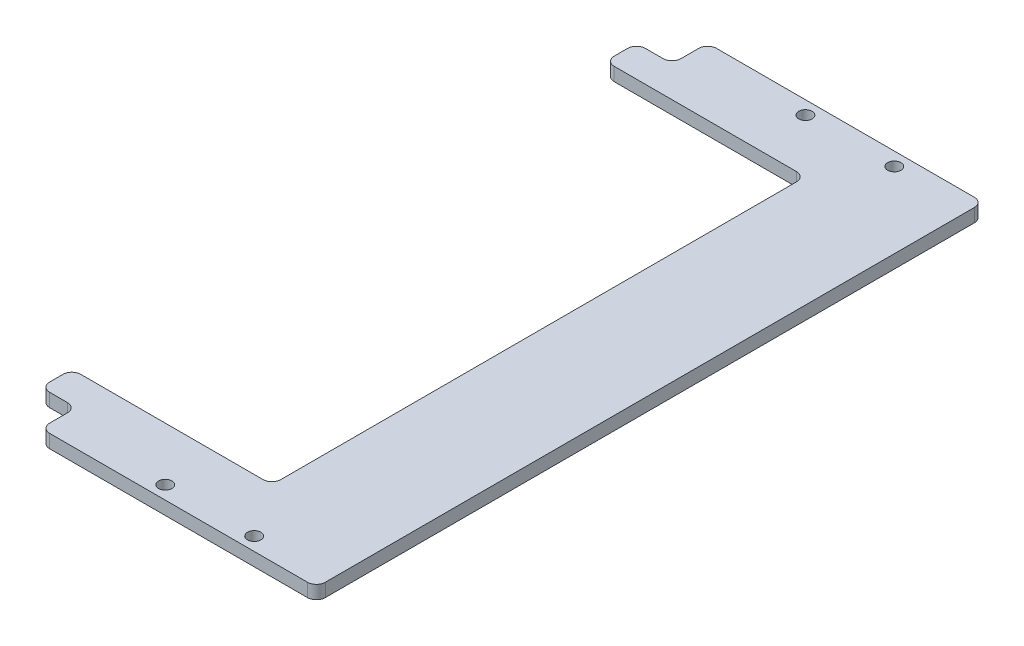
ISO-10303-21;
HEADER;
FILE_DESCRIPTION(('STEP AP214'),'2;1');
FILE_NAME('part.step','',(''),(''),'','','');
FILE_SCHEMA(('AUTOMOTIVE_DESIGN { 1 0 10303 214 1 1 1 1 }'));
ENDSEC;
DATA;
#1=APPLICATION_CONTEXT('core data for automotive mechanical design processes');
#2=APPLICATION_PROTOCOL_DEFINITION('international standard','automotive_design',2000,#1);
#3=PRODUCT_CONTEXT('',#1,'mechanical');
#4=PRODUCT('Part','Part','',(#3));
#5=PRODUCT_RELATED_PRODUCT_CATEGORY('part','',(#4));
#6=PRODUCT_DEFINITION_FORMATION('','',#4);
#7=PRODUCT_DEFINITION_CONTEXT('part definition',#1,'design');
#8=PRODUCT_DEFINITION('design','',#6,#7);
#9=PRODUCT_DEFINITION_SHAPE('','',#8);
#10=(LENGTH_UNIT() NAMED_UNIT(*) SI_UNIT(.MILLI.,.METRE.));
#11=(NAMED_UNIT(*) PLANE_ANGLE_UNIT() SI_UNIT($,.RADIAN.));
#12=(NAMED_UNIT(*) SI_UNIT($,.STERADIAN.) SOLID_ANGLE_UNIT());
#13=UNCERTAINTY_MEASURE_WITH_UNIT(LENGTH_MEASURE(1.E-05),#10,'distance_accuracy_value','');
#14=(GEOMETRIC_REPRESENTATION_CONTEXT(3) GLOBAL_UNCERTAINTY_ASSIGNED_CONTEXT((#13)) GLOBAL_UNIT_ASSIGNED_CONTEXT((#10,
#11,#12)) REPRESENTATION_CONTEXT('',''));
#15=CARTESIAN_POINT('',(0.,0.,0.));
#16=DIRECTION('',(0.,0.,1.));
#17=DIRECTION('',(1.,0.,0.));
#18=AXIS2_PLACEMENT_3D('',#15,#16,#17);
#19=CARTESIAN_POINT('',(0.,3.,0.));
#20=DIRECTION('',(0.,0.,-1.));
#21=DIRECTION('',(-1.,0.,0.));
#22=AXIS2_PLACEMENT_3D('',#19,#20,#21);
#23=PLANE('',#22);
#24=DIRECTION('',(1.,0.,0.));
#25=VECTOR('',#24,1.);
#26=CARTESIAN_POINT('',(0.,0.,0.));
#27=LINE('',#26,#25);
#28=CARTESIAN_POINT('',(10.,0.,0.));
#29=VERTEX_POINT('',#28);
#30=CARTESIAN_POINT('',(68.,0.,0.));
#31=VERTEX_POINT('',#30);
#32=EDGE_CURVE('E229',#29,#31,#27,.T.);
#33=ORIENTED_EDGE('',*,*,#32,.T.);
#34=DIRECTION('',(0.,-1.,0.));
#35=VECTOR('',#34,1.);
#36=CARTESIAN_POINT('',(68.,3.,0.));
#37=LINE('',#36,#35);
#38=CARTESIAN_POINT('',(68.,3.,0.));
#39=VERTEX_POINT('',#38);
#40=EDGE_CURVE('E210',#31,#39,#37,.F.);
#41=ORIENTED_EDGE('',*,*,#40,.T.);
#42=DIRECTION('',(1.,0.,0.));
#43=VECTOR('',#42,1.);
#44=CARTESIAN_POINT('',(0.,3.,0.));
#45=LINE('',#44,#43);
#46=CARTESIAN_POINT('',(10.,3.,0.));
#47=VERTEX_POINT('',#46);
#48=EDGE_CURVE('E412',#47,#39,#45,.T.);
#49=ORIENTED_EDGE('',*,*,#48,.F.);
#50=DIRECTION('',(0.,1.,0.));
#51=VECTOR('',#50,1.);
#52=CARTESIAN_POINT('',(10.,3.,0.));
#53=LINE('',#52,#51);
#54=EDGE_CURVE('E215',#47,#29,#53,.F.);
#55=ORIENTED_EDGE('',*,*,#54,.T.);
#56=EDGE_LOOP('',(#33,#41,#49,#55));
#57=FACE_BOUND('',#56,.T.);
#58=ADVANCED_FACE('F41',(#57),#23,.F.);
#59=CARTESIAN_POINT('',(0.,3.,-150.));
#60=DIRECTION('',(1.,0.,0.));
#61=DIRECTION('',(0.,0.,-1.));
#62=AXIS2_PLACEMENT_3D('',#59,#60,#61);
#63=PLANE('',#62);
#64=DIRECTION('',(0.,0.,1.));
#65=VECTOR('',#64,1.);
#66=CARTESIAN_POINT('',(0.,3.,-150.));
#67=LINE('',#66,#65);
#68=CARTESIAN_POINT('',(0.,3.,-140.));
#69=VERTEX_POINT('',#68);
#70=CARTESIAN_POINT('',(0.,3.,-137.));
#71=VERTEX_POINT('',#70);
#72=EDGE_CURVE('E407',#69,#71,#67,.T.);
#73=ORIENTED_EDGE('',*,*,#72,.F.);
#74=DIRECTION('',(0.,1.,0.));
#75=VECTOR('',#74,1.);
#76=CARTESIAN_POINT('',(0.,3.,-140.));
#77=LINE('',#76,#75);
#78=CARTESIAN_POINT('',(0.,0.,-140.));
#79=VERTEX_POINT('',#78);
#80=EDGE_CURVE('E324',#69,#79,#77,.F.);
#81=ORIENTED_EDGE('',*,*,#80,.T.);
#82=DIRECTION('',(0.,0.,1.));
#83=VECTOR('',#82,1.);
#84=CARTESIAN_POINT('',(0.,0.,-150.));
#85=LINE('',#84,#83);
#86=CARTESIAN_POINT('',(0.,0.,-137.));
#87=VERTEX_POINT('',#86);
#88=EDGE_CURVE('E235',#79,#87,#85,.T.);
#89=ORIENTED_EDGE('',*,*,#88,.T.);
#90=DIRECTION('',(0.,-1.,0.));
#91=VECTOR('',#90,1.);
#92=CARTESIAN_POINT('',(0.,3.,-137.));
#93=LINE('',#92,#91);
#94=EDGE_CURVE('E323',#87,#71,#93,.F.);
#95=ORIENTED_EDGE('',*,*,#94,.T.);
#96=EDGE_LOOP('',(#73,#81,#89,#95));
#97=FACE_BOUND('',#96,.T.);
#98=ADVANCED_FACE('F462',(#97),#63,.F.);
#99=CARTESIAN_POINT('',(0.,3.,-15.));
#100=DIRECTION('',(1.,0.,0.));
#101=DIRECTION('',(0.,0.,-1.));
#102=AXIS2_PLACEMENT_3D('',#99,#100,#101);
#103=PLANE('',#102);
#104=DIRECTION('',(0.,0.,1.));
#105=VECTOR('',#104,1.);
#106=CARTESIAN_POINT('',(0.,3.,-15.));
#107=LINE('',#106,#105);
#108=CARTESIAN_POINT('',(0.,3.,-13.));
#109=VERTEX_POINT('',#108);
#110=CARTESIAN_POINT('',(0.,3.,-10.));
#111=VERTEX_POINT('',#110);
#112=EDGE_CURVE('E248',#109,#111,#107,.T.);
#113=ORIENTED_EDGE('',*,*,#112,.F.);
#114=DIRECTION('',(0.,-1.,0.));
#115=VECTOR('',#114,1.);
#116=CARTESIAN_POINT('',(0.,3.,-13.));
#117=LINE('',#116,#115);
#118=CARTESIAN_POINT('',(0.,0.,-13.));
#119=VERTEX_POINT('',#118);
#120=EDGE_CURVE('E344',#109,#119,#117,.T.);
#121=ORIENTED_EDGE('',*,*,#120,.T.);
#122=DIRECTION('',(0.,0.,1.));
#123=VECTOR('',#122,1.);
#124=CARTESIAN_POINT('',(0.,0.,-15.));
#125=LINE('',#124,#123);
#126=CARTESIAN_POINT('',(0.,0.,-10.));
#127=VERTEX_POINT('',#126);
#128=EDGE_CURVE('E233',#119,#127,#125,.T.);
#129=ORIENTED_EDGE('',*,*,#128,.T.);
#130=DIRECTION('',(0.,1.,0.));
#131=VECTOR('',#130,1.);
#132=CARTESIAN_POINT('',(0.,3.,-10.));
#133=LINE('',#132,#131);
#134=EDGE_CURVE('E345',#127,#111,#133,.T.);
#135=ORIENTED_EDGE('',*,*,#134,.T.);
#136=EDGE_LOOP('',(#113,#121,#129,#135));
#137=FACE_BOUND('',#136,.T.);
#138=ADVANCED_FACE('F394',(#137),#103,.F.);
#139=CARTESIAN_POINT('',(70.,3.,0.));
#140=DIRECTION('',(-1.,0.,0.));
#141=DIRECTION('',(0.,0.,1.));
#142=AXIS2_PLACEMENT_3D('',#139,#140,#141);
#143=PLANE('',#142);
#144=DIRECTION('',(0.,0.,-1.));
#145=VECTOR('',#144,1.);
#146=CARTESIAN_POINT('',(70.,3.,0.));
#147=LINE('',#146,#145);
#148=CARTESIAN_POINT('',(70.,3.,-2.));
#149=VERTEX_POINT('',#148);
#150=CARTESIAN_POINT('',(70.,3.,-148.));
#151=VERTEX_POINT('',#150);
#152=EDGE_CURVE('E225',#149,#151,#147,.T.);
#153=ORIENTED_EDGE('',*,*,#152,.F.);
#154=DIRECTION('',(0.,-1.,0.));
#155=VECTOR('',#154,1.);
#156=CARTESIAN_POINT('',(70.,3.,-2.));
#157=LINE('',#156,#155);
#158=CARTESIAN_POINT('',(70.,0.,-2.));
#159=VERTEX_POINT('',#158);
#160=EDGE_CURVE('E206',#149,#159,#157,.T.);
#161=ORIENTED_EDGE('',*,*,#160,.T.);
#162=DIRECTION('',(0.,0.,-1.));
#163=VECTOR('',#162,1.);
#164=CARTESIAN_POINT('',(70.,0.,0.));
#165=LINE('',#164,#163);
#166=CARTESIAN_POINT('',(70.,0.,-148.));
#167=VERTEX_POINT('',#166);
#168=EDGE_CURVE('E218',#159,#167,#165,.T.);
#169=ORIENTED_EDGE('',*,*,#168,.T.);
#170=DIRECTION('',(0.,-1.,0.));
#171=VECTOR('',#170,1.);
#172=CARTESIAN_POINT('',(70.,3.,-148.));
#173=LINE('',#172,#171);
#174=EDGE_CURVE('E221',#167,#151,#173,.F.);
#175=ORIENTED_EDGE('',*,*,#174,.T.);
#176=EDGE_LOOP('',(#153,#161,#169,#175));
#177=FACE_BOUND('',#176,.T.);
#178=ADVANCED_FACE('F217',(#177),#143,.F.);
#179=CARTESIAN_POINT('',(70.,3.,-150.));
#180=DIRECTION('',(0.,0.,1.));
#181=DIRECTION('',(1.,0.,0.));
#182=AXIS2_PLACEMENT_3D('',#179,#180,#181);
#183=PLANE('',#182);
#184=DIRECTION('',(-1.,0.,0.));
#185=VECTOR('',#184,1.);
#186=CARTESIAN_POINT('',(70.,3.,-150.));
#187=LINE('',#186,#185);
#188=CARTESIAN_POINT('',(68.,3.,-150.));
#189=VERTEX_POINT('',#188);
#190=CARTESIAN_POINT('',(9.99999999999998,3.,-150.));
#191=VERTEX_POINT('',#190);
#192=EDGE_CURVE('E409',#189,#191,#187,.T.);
#193=ORIENTED_EDGE('',*,*,#192,.F.);
#194=DIRECTION('',(0.,-1.,0.));
#195=VECTOR('',#194,1.);
#196=CARTESIAN_POINT('',(68.,3.,-150.));
#197=LINE('',#196,#195);
#198=CARTESIAN_POINT('',(68.,0.,-150.));
#199=VERTEX_POINT('',#198);
#200=EDGE_CURVE('E309',#189,#199,#197,.T.);
#201=ORIENTED_EDGE('',*,*,#200,.T.);
#202=DIRECTION('',(-1.,0.,0.));
#203=VECTOR('',#202,1.);
#204=CARTESIAN_POINT('',(70.,0.,-150.));
#205=LINE('',#204,#203);
#206=CARTESIAN_POINT('',(9.99999999999998,0.,-150.));
#207=VERTEX_POINT('',#206);
#208=EDGE_CURVE('E228',#199,#207,#205,.T.);
#209=ORIENTED_EDGE('',*,*,#208,.T.);
#210=DIRECTION('',(0.,1.,0.));
#211=VECTOR('',#210,1.);
#212=CARTESIAN_POINT('',(9.99999999999998,3.,-150.));
#213=LINE('',#212,#211);
#214=EDGE_CURVE('E307',#207,#191,#213,.T.);
#215=ORIENTED_EDGE('',*,*,#214,.T.);
#216=EDGE_LOOP('',(#193,#201,#209,#215));
#217=FACE_BOUND('',#216,.T.);
#218=ADVANCED_FACE('F524',(#217),#183,.F.);
#219=CARTESIAN_POINT('',(0.,3.,-135.));
#220=DIRECTION('',(0.,0.,-1.));
#221=DIRECTION('',(-1.,0.,0.));
#222=AXIS2_PLACEMENT_3D('',#219,#220,#221);
#223=PLANE('',#222);
#224=DIRECTION('',(1.,0.,0.));
#225=VECTOR('',#224,1.);
#226=CARTESIAN_POINT('',(0.,3.,-135.));
#227=LINE('',#226,#225);
#228=CARTESIAN_POINT('',(2.,3.,-135.));
#229=VERTEX_POINT('',#228);
#230=CARTESIAN_POINT('',(43.,3.,-135.));
#231=VERTEX_POINT('',#230);
#232=EDGE_CURVE('E401',#229,#231,#227,.T.);
#233=ORIENTED_EDGE('',*,*,#232,.F.);
#234=DIRECTION('',(0.,-1.,0.));
#235=VECTOR('',#234,1.);
#236=CARTESIAN_POINT('',(2.,3.,-135.));
#237=LINE('',#236,#235);
#238=CARTESIAN_POINT('',(2.,0.,-135.));
#239=VERTEX_POINT('',#238);
#240=EDGE_CURVE('E328',#229,#239,#237,.T.);
#241=ORIENTED_EDGE('',*,*,#240,.T.);
#242=DIRECTION('',(1.,0.,0.));
#243=VECTOR('',#242,1.);
#244=CARTESIAN_POINT('',(0.,0.,-135.));
#245=LINE('',#244,#243);
#246=CARTESIAN_POINT('',(43.,0.,-135.));
#247=VERTEX_POINT('',#246);
#248=EDGE_CURVE('E238',#239,#247,#245,.T.);
#249=ORIENTED_EDGE('',*,*,#248,.T.);
#250=DIRECTION('',(0.,-1.,0.));
#251=VECTOR('',#250,1.);
#252=CARTESIAN_POINT('',(43.,3.,-135.));
#253=LINE('',#252,#251);
#254=EDGE_CURVE('E330',#247,#231,#253,.F.);
#255=ORIENTED_EDGE('',*,*,#254,.T.);
#256=EDGE_LOOP('',(#233,#241,#249,#255));
#257=FACE_BOUND('',#256,.T.);
#258=ADVANCED_FACE('F547',(#257),#223,.F.);
#259=CARTESIAN_POINT('',(45.,3.,-135.));
#260=DIRECTION('',(1.,0.,0.));
#261=DIRECTION('',(0.,0.,-1.));
#262=AXIS2_PLACEMENT_3D('',#259,#260,#261);
#263=PLANE('',#262);
#264=DIRECTION('',(0.,0.,1.));
#265=VECTOR('',#264,1.);
#266=CARTESIAN_POINT('',(45.,3.,-135.));
#267=LINE('',#266,#265);
#268=CARTESIAN_POINT('',(45.,3.,-133.));
#269=VERTEX_POINT('',#268);
#270=CARTESIAN_POINT('',(45.,3.,-17.0000000000001));
#271=VERTEX_POINT('',#270);
#272=EDGE_CURVE('E399',#269,#271,#267,.T.);
#273=ORIENTED_EDGE('',*,*,#272,.F.);
#274=DIRECTION('',(0.,-1.,0.));
#275=VECTOR('',#274,1.);
#276=CARTESIAN_POINT('',(45.,0.,-133.));
#277=LINE('',#276,#275);
#278=CARTESIAN_POINT('',(45.,0.,-133.));
#279=VERTEX_POINT('',#278);
#280=EDGE_CURVE('E331',#269,#279,#277,.T.);
#281=ORIENTED_EDGE('',*,*,#280,.T.);
#282=DIRECTION('',(0.,0.,1.));
#283=VECTOR('',#282,1.);
#284=CARTESIAN_POINT('',(45.,0.,-135.));
#285=LINE('',#284,#283);
#286=CARTESIAN_POINT('',(45.,0.,-17.0000000000001));
#287=VERTEX_POINT('',#286);
#288=EDGE_CURVE('E243',#279,#287,#285,.T.);
#289=ORIENTED_EDGE('',*,*,#288,.T.);
#290=DIRECTION('',(0.,-1.,0.));
#291=VECTOR('',#290,1.);
#292=CARTESIAN_POINT('',(45.,3.,-17.));
#293=LINE('',#292,#291);
#294=EDGE_CURVE('E335',#287,#271,#293,.F.);
#295=ORIENTED_EDGE('',*,*,#294,.T.);
#296=EDGE_LOOP('',(#273,#281,#289,#295));
#297=FACE_BOUND('',#296,.T.);
#298=ADVANCED_FACE('F553',(#297),#263,.F.);
#299=CARTESIAN_POINT('',(45.,3.,-15.));
#300=DIRECTION('',(0.,0.,1.));
#301=DIRECTION('',(1.,0.,0.));
#302=AXIS2_PLACEMENT_3D('',#299,#300,#301);
#303=PLANE('',#302);
#304=DIRECTION('',(-1.,0.,0.));
#305=VECTOR('',#304,1.);
#306=CARTESIAN_POINT('',(45.,3.,-15.));
#307=LINE('',#306,#305);
#308=CARTESIAN_POINT('',(43.,3.,-15.));
#309=VERTEX_POINT('',#308);
#310=CARTESIAN_POINT('',(2.00000000000002,3.,-15.));
#311=VERTEX_POINT('',#310);
#312=EDGE_CURVE('E255',#309,#311,#307,.T.);
#313=ORIENTED_EDGE('',*,*,#312,.F.);
#314=DIRECTION('',(0.,-1.,0.));
#315=VECTOR('',#314,1.);
#316=CARTESIAN_POINT('',(43.,0.,-15.));
#317=LINE('',#316,#315);
#318=CARTESIAN_POINT('',(43.,0.,-15.));
#319=VERTEX_POINT('',#318);
#320=EDGE_CURVE('E339',#309,#319,#317,.T.);
#321=ORIENTED_EDGE('',*,*,#320,.T.);
#322=DIRECTION('',(-1.,0.,0.));
#323=VECTOR('',#322,1.);
#324=CARTESIAN_POINT('',(45.,0.,-15.));
#325=LINE('',#324,#323);
#326=CARTESIAN_POINT('',(2.00000000000002,0.,-15.));
#327=VERTEX_POINT('',#326);
#328=EDGE_CURVE('E246',#319,#327,#325,.T.);
#329=ORIENTED_EDGE('',*,*,#328,.T.);
#330=DIRECTION('',(0.,-1.,0.));
#331=VECTOR('',#330,1.);
#332=CARTESIAN_POINT('',(2.,3.,-15.));
#333=LINE('',#332,#331);
#334=EDGE_CURVE('E340',#327,#311,#333,.F.);
#335=ORIENTED_EDGE('',*,*,#334,.T.);
#336=EDGE_LOOP('',(#313,#321,#329,#335));
#337=FACE_BOUND('',#336,.T.);
#338=ADVANCED_FACE('F440',(#337),#303,.F.);
#339=CARTESIAN_POINT('',(0.,3.,0.));
#340=DIRECTION('',(0.,1.,0.));
#341=DIRECTION('',(0.,0.,1.));
#342=AXIS2_PLACEMENT_3D('',#339,#340,#341);
#343=PLANE('',#342);
#344=CARTESIAN_POINT('',(33.0000000000002,3.,-147.));
#345=DIRECTION('',(0.,1.,0.));
#346=DIRECTION('',(0.,0.,-1.));
#347=AXIS2_PLACEMENT_3D('',#344,#345,#346);
#348=CIRCLE('',#347,1.5);
#349=CARTESIAN_POINT('',(33.0000000000002,3.,-148.5));
#350=VERTEX_POINT('',#349);
#351=EDGE_CURVE('E421',#350,#350,#348,.T.);
#352=ORIENTED_EDGE('',*,*,#351,.F.);
#353=EDGE_LOOP('',(#352));
#354=FACE_BOUND('',#353,.T.);
#355=CARTESIAN_POINT('',(53.0000000000002,3.,-147.));
#356=DIRECTION('',(0.,1.,0.));
#357=DIRECTION('',(0.,0.,-1.));
#358=AXIS2_PLACEMENT_3D('',#355,#356,#357);
#359=CIRCLE('',#358,1.5);
#360=CARTESIAN_POINT('',(53.0000000000002,3.,-148.5));
#361=VERTEX_POINT('',#360);
#362=EDGE_CURVE('E426',#361,#361,#359,.T.);
#363=ORIENTED_EDGE('',*,*,#362,.F.);
#364=EDGE_LOOP('',(#363));
#365=FACE_BOUND('',#364,.T.);
#366=CARTESIAN_POINT('',(53.,3.,-3.));
#367=DIRECTION('',(0.,1.,0.));
#368=DIRECTION('',(0.,0.,1.));
#369=AXIS2_PLACEMENT_3D('',#366,#367,#368);
#370=CIRCLE('',#369,1.5);
#371=CARTESIAN_POINT('',(53.,3.,-1.5));
#372=VERTEX_POINT('',#371);
#373=EDGE_CURVE('E425',#372,#372,#370,.T.);
#374=ORIENTED_EDGE('',*,*,#373,.F.);
#375=EDGE_LOOP('',(#374));
#376=FACE_BOUND('',#375,.T.);
#377=CARTESIAN_POINT('',(33.,3.,-3.));
#378=DIRECTION('',(0.,1.,0.));
#379=DIRECTION('',(0.,0.,1.));
#380=AXIS2_PLACEMENT_3D('',#377,#378,#379);
#381=CIRCLE('',#380,1.5);
#382=CARTESIAN_POINT('',(33.,3.,-1.5));
#383=VERTEX_POINT('',#382);
#384=EDGE_CURVE('E270',#383,#383,#381,.T.);
#385=ORIENTED_EDGE('',*,*,#384,.F.);
#386=EDGE_LOOP('',(#385));
#387=FACE_BOUND('',#386,.T.);
#388=ORIENTED_EDGE('',*,*,#48,.T.);
#389=CARTESIAN_POINT('',(68.,3.,-2.));
#390=DIRECTION('',(0.,1.,0.));
#391=DIRECTION('',(0.,0.,1.));
#392=AXIS2_PLACEMENT_3D('',#389,#390,#391);
#393=CIRCLE('',#392,2.);
#394=EDGE_CURVE('E304',#39,#149,#393,.T.);
#395=ORIENTED_EDGE('',*,*,#394,.T.);
#396=ORIENTED_EDGE('',*,*,#152,.T.);
#397=CARTESIAN_POINT('',(68.,3.,-148.));
#398=DIRECTION('',(0.,1.,0.));
#399=DIRECTION('',(0.,0.,1.));
#400=AXIS2_PLACEMENT_3D('',#397,#398,#399);
#401=CIRCLE('',#400,2.);
#402=EDGE_CURVE('E302',#151,#189,#401,.T.);
#403=ORIENTED_EDGE('',*,*,#402,.T.);
#404=ORIENTED_EDGE('',*,*,#192,.T.);
#405=CARTESIAN_POINT('',(9.99999999999998,3.,-148.));
#406=DIRECTION('',(0.,1.,0.));
#407=DIRECTION('',(0.,0.,1.));
#408=AXIS2_PLACEMENT_3D('',#405,#406,#407);
#409=CIRCLE('',#408,2.);
#410=CARTESIAN_POINT('',(7.99999999999998,3.,-148.));
#411=VERTEX_POINT('',#410);
#412=EDGE_CURVE('E301',#191,#411,#409,.T.);
#413=ORIENTED_EDGE('',*,*,#412,.T.);
#414=DIRECTION('',(0.,0.,-1.));
#415=VECTOR('',#414,1.);
#416=CARTESIAN_POINT('',(7.99999999999998,3.,-150.));
#417=LINE('',#416,#415);
#418=CARTESIAN_POINT('',(7.99999999999998,3.,-144.));
#419=VERTEX_POINT('',#418);
#420=EDGE_CURVE('E277',#419,#411,#417,.T.);
#421=ORIENTED_EDGE('',*,*,#420,.F.);
#422=CARTESIAN_POINT('',(5.99999999999998,3.,-144.));
#423=DIRECTION('',(0.,1.,0.));
#424=DIRECTION('',(0.,0.,1.));
#425=AXIS2_PLACEMENT_3D('',#422,#423,#424);
#426=CIRCLE('',#425,2.);
#427=CARTESIAN_POINT('',(5.99999999999999,3.,-142.));
#428=VERTEX_POINT('',#427);
#429=EDGE_CURVE('E360',#419,#428,#426,.F.);
#430=ORIENTED_EDGE('',*,*,#429,.T.);
#431=DIRECTION('',(1.,0.,0.));
#432=VECTOR('',#431,1.);
#433=CARTESIAN_POINT('',(0.,3.,-142.));
#434=LINE('',#433,#432);
#435=CARTESIAN_POINT('',(1.99999999999999,3.,-142.));
#436=VERTEX_POINT('',#435);
#437=EDGE_CURVE('E378',#436,#428,#434,.T.);
#438=ORIENTED_EDGE('',*,*,#437,.F.);
#439=CARTESIAN_POINT('',(2.,3.,-140.));
#440=DIRECTION('',(0.,1.,0.));
#441=DIRECTION('',(0.,0.,1.));
#442=AXIS2_PLACEMENT_3D('',#439,#440,#441);
#443=CIRCLE('',#442,2.);
#444=EDGE_CURVE('E299',#436,#69,#443,.T.);
#445=ORIENTED_EDGE('',*,*,#444,.T.);
#446=ORIENTED_EDGE('',*,*,#72,.T.);
#447=CARTESIAN_POINT('',(2.,3.,-137.));
#448=DIRECTION('',(0.,1.,0.));
#449=DIRECTION('',(0.,0.,1.));
#450=AXIS2_PLACEMENT_3D('',#447,#448,#449);
#451=CIRCLE('',#450,2.);
#452=EDGE_CURVE('E300',#71,#229,#451,.T.);
#453=ORIENTED_EDGE('',*,*,#452,.T.);
#454=ORIENTED_EDGE('',*,*,#232,.T.);
#455=CARTESIAN_POINT('',(43.,3.,-133.));
#456=DIRECTION('',(0.,1.,0.));
#457=DIRECTION('',(0.,0.,1.));
#458=AXIS2_PLACEMENT_3D('',#455,#456,#457);
#459=CIRCLE('',#458,2.);
#460=EDGE_CURVE('E361',#231,#269,#459,.F.);
#461=ORIENTED_EDGE('',*,*,#460,.T.);
#462=ORIENTED_EDGE('',*,*,#272,.T.);
#463=CARTESIAN_POINT('',(43.,3.,-17.));
#464=DIRECTION('',(0.,1.,0.));
#465=DIRECTION('',(0.,0.,1.));
#466=AXIS2_PLACEMENT_3D('',#463,#464,#465);
#467=CIRCLE('',#466,2.);
#468=EDGE_CURVE('E370',#271,#309,#467,.F.);
#469=ORIENTED_EDGE('',*,*,#468,.T.);
#470=ORIENTED_EDGE('',*,*,#312,.T.);
#471=CARTESIAN_POINT('',(2.,3.,-13.));
#472=DIRECTION('',(0.,1.,0.));
#473=DIRECTION('',(0.,0.,1.));
#474=AXIS2_PLACEMENT_3D('',#471,#472,#473);
#475=CIRCLE('',#474,2.);
#476=EDGE_CURVE('E293',#311,#109,#475,.T.);
#477=ORIENTED_EDGE('',*,*,#476,.T.);
#478=ORIENTED_EDGE('',*,*,#112,.T.);
#479=CARTESIAN_POINT('',(2.,3.,-10.));
#480=DIRECTION('',(0.,1.,0.));
#481=DIRECTION('',(0.,0.,1.));
#482=AXIS2_PLACEMENT_3D('',#479,#480,#481);
#483=CIRCLE('',#482,2.);
#484=CARTESIAN_POINT('',(2.,3.,-8.));
#485=VERTEX_POINT('',#484);
#486=EDGE_CURVE('E57',#111,#485,#483,.T.);
#487=ORIENTED_EDGE('',*,*,#486,.T.);
#488=DIRECTION('',(-1.,0.,0.));
#489=VECTOR('',#488,1.);
#490=CARTESIAN_POINT('',(0.,3.,-8.));
#491=LINE('',#490,#489);
#492=CARTESIAN_POINT('',(6.,3.,-8.));
#493=VERTEX_POINT('',#492);
#494=EDGE_CURVE('E373',#493,#485,#491,.T.);
#495=ORIENTED_EDGE('',*,*,#494,.F.);
#496=CARTESIAN_POINT('',(6.,3.,-6.));
#497=DIRECTION('',(0.,1.,0.));
#498=DIRECTION('',(0.,0.,1.));
#499=AXIS2_PLACEMENT_3D('',#496,#497,#498);
#500=CIRCLE('',#499,2.);
#501=CARTESIAN_POINT('',(8.,3.,-6.));
#502=VERTEX_POINT('',#501);
#503=EDGE_CURVE('E47',#493,#502,#500,.F.);
#504=ORIENTED_EDGE('',*,*,#503,.T.);
#505=DIRECTION('',(0.,0.,-1.));
#506=VECTOR('',#505,1.);
#507=CARTESIAN_POINT('',(8.,3.,0.));
#508=LINE('',#507,#506);
#509=CARTESIAN_POINT('',(8.,3.,-2.));
#510=VERTEX_POINT('',#509);
#511=EDGE_CURVE('E375',#510,#502,#508,.T.);
#512=ORIENTED_EDGE('',*,*,#511,.F.);
#513=CARTESIAN_POINT('',(10.,3.,-2.));
#514=DIRECTION('',(0.,1.,0.));
#515=DIRECTION('',(0.,0.,1.));
#516=AXIS2_PLACEMENT_3D('',#513,#514,#515);
#517=CIRCLE('',#516,2.);
#518=EDGE_CURVE('E295',#510,#47,#517,.T.);
#519=ORIENTED_EDGE('',*,*,#518,.T.);
#520=EDGE_LOOP('',(#388,#395,#396,#403,#404,#413,#421,#430,#438,#445,#446,#453,#454,#461,#462,
#469,#470,#477,#478,#487,#495,#504,#512,#519));
#521=FACE_BOUND('',#520,.T.);
#522=ADVANCED_FACE('F371',(#354,#365,#376,#387,#521),#343,.T.);
#523=CARTESIAN_POINT('',(0.,0.,0.));
#524=DIRECTION('',(0.,1.,0.));
#525=DIRECTION('',(0.,0.,1.));
#526=AXIS2_PLACEMENT_3D('',#523,#524,#525);
#527=PLANE('',#526);
#528=CARTESIAN_POINT('',(33.0000000000002,0.,-147.));
#529=DIRECTION('',(0.,1.,0.));
#530=DIRECTION('',(0.,0.,1.));
#531=AXIS2_PLACEMENT_3D('',#528,#529,#530);
#532=CIRCLE('',#531,1.5);
#533=CARTESIAN_POINT('',(33.0000000000002,0.,-145.5));
#534=VERTEX_POINT('',#533);
#535=EDGE_CURVE('E272',#534,#534,#532,.T.);
#536=ORIENTED_EDGE('',*,*,#535,.T.);
#537=EDGE_LOOP('',(#536));
#538=FACE_BOUND('',#537,.T.);
#539=CARTESIAN_POINT('',(53.0000000000002,0.,-147.));
#540=DIRECTION('',(0.,1.,0.));
#541=DIRECTION('',(0.,0.,1.));
#542=AXIS2_PLACEMENT_3D('',#539,#540,#541);
#543=CIRCLE('',#542,1.5);
#544=CARTESIAN_POINT('',(53.0000000000002,0.,-145.5));
#545=VERTEX_POINT('',#544);
#546=EDGE_CURVE('E269',#545,#545,#543,.T.);
#547=ORIENTED_EDGE('',*,*,#546,.T.);
#548=EDGE_LOOP('',(#547));
#549=FACE_BOUND('',#548,.T.);
#550=CARTESIAN_POINT('',(53.,0.,-3.));
#551=DIRECTION('',(0.,1.,0.));
#552=DIRECTION('',(0.,0.,1.));
#553=AXIS2_PLACEMENT_3D('',#550,#551,#552);
#554=CIRCLE('',#553,1.5);
#555=CARTESIAN_POINT('',(53.,0.,-1.5));
#556=VERTEX_POINT('',#555);
#557=EDGE_CURVE('E266',#556,#556,#554,.T.);
#558=ORIENTED_EDGE('',*,*,#557,.T.);
#559=EDGE_LOOP('',(#558));
#560=FACE_BOUND('',#559,.T.);
#561=CARTESIAN_POINT('',(33.,0.,-3.));
#562=DIRECTION('',(0.,1.,0.));
#563=DIRECTION('',(0.,0.,1.));
#564=AXIS2_PLACEMENT_3D('',#561,#562,#563);
#565=CIRCLE('',#564,1.5);
#566=CARTESIAN_POINT('',(33.,0.,-1.5));
#567=VERTEX_POINT('',#566);
#568=EDGE_CURVE('E263',#567,#567,#565,.T.);
#569=ORIENTED_EDGE('',*,*,#568,.T.);
#570=EDGE_LOOP('',(#569));
#571=FACE_BOUND('',#570,.T.);
#572=ORIENTED_EDGE('',*,*,#168,.F.);
#573=CARTESIAN_POINT('',(68.,0.,-2.));
#574=DIRECTION('',(0.,1.,0.));
#575=DIRECTION('',(0.,0.,1.));
#576=AXIS2_PLACEMENT_3D('',#573,#574,#575);
#577=CIRCLE('',#576,2.);
#578=EDGE_CURVE('E205',#159,#31,#577,.F.);
#579=ORIENTED_EDGE('',*,*,#578,.T.);
#580=ORIENTED_EDGE('',*,*,#32,.F.);
#581=CARTESIAN_POINT('',(10.,0.,-2.));
#582=DIRECTION('',(0.,1.,0.));
#583=DIRECTION('',(0.,0.,1.));
#584=AXIS2_PLACEMENT_3D('',#581,#582,#583);
#585=CIRCLE('',#584,2.);
#586=CARTESIAN_POINT('',(8.,0.,-2.));
#587=VERTEX_POINT('',#586);
#588=EDGE_CURVE('E224',#29,#587,#585,.F.);
#589=ORIENTED_EDGE('',*,*,#588,.T.);
#590=DIRECTION('',(0.,0.,-1.));
#591=VECTOR('',#590,1.);
#592=CARTESIAN_POINT('',(8.,0.,0.));
#593=LINE('',#592,#591);
#594=CARTESIAN_POINT('',(8.,0.,-6.));
#595=VERTEX_POINT('',#594);
#596=EDGE_CURVE('E260',#587,#595,#593,.T.);
#597=ORIENTED_EDGE('',*,*,#596,.T.);
#598=CARTESIAN_POINT('',(6.,0.,-6.));
#599=DIRECTION('',(0.,1.,0.));
#600=DIRECTION('',(0.,0.,1.));
#601=AXIS2_PLACEMENT_3D('',#598,#599,#600);
#602=CIRCLE('',#601,2.);
#603=CARTESIAN_POINT('',(6.,0.,-8.));
#604=VERTEX_POINT('',#603);
#605=EDGE_CURVE('E11',#595,#604,#602,.T.);
#606=ORIENTED_EDGE('',*,*,#605,.T.);
#607=DIRECTION('',(-1.,0.,0.));
#608=VECTOR('',#607,1.);
#609=CARTESIAN_POINT('',(0.,0.,-8.));
#610=LINE('',#609,#608);
#611=CARTESIAN_POINT('',(2.,0.,-8.));
#612=VERTEX_POINT('',#611);
#613=EDGE_CURVE('E257',#604,#612,#610,.T.);
#614=ORIENTED_EDGE('',*,*,#613,.T.);
#615=CARTESIAN_POINT('',(2.,0.,-10.));
#616=DIRECTION('',(0.,1.,0.));
#617=DIRECTION('',(0.,0.,1.));
#618=AXIS2_PLACEMENT_3D('',#615,#616,#617);
#619=CIRCLE('',#618,2.);
#620=EDGE_CURVE('E276',#612,#127,#619,.F.);
#621=ORIENTED_EDGE('',*,*,#620,.T.);
#622=ORIENTED_EDGE('',*,*,#128,.F.);
#623=CARTESIAN_POINT('',(2.,0.,-13.));
#624=DIRECTION('',(0.,1.,0.));
#625=DIRECTION('',(0.,0.,1.));
#626=AXIS2_PLACEMENT_3D('',#623,#624,#625);
#627=CIRCLE('',#626,2.);
#628=EDGE_CURVE('E282',#119,#327,#627,.F.);
#629=ORIENTED_EDGE('',*,*,#628,.T.);
#630=ORIENTED_EDGE('',*,*,#328,.F.);
#631=CARTESIAN_POINT('',(43.,0.,-17.));
#632=DIRECTION('',(0.,1.,0.));
#633=DIRECTION('',(0.,0.,1.));
#634=AXIS2_PLACEMENT_3D('',#631,#632,#633);
#635=CIRCLE('',#634,2.);
#636=EDGE_CURVE('E364',#319,#287,#635,.T.);
#637=ORIENTED_EDGE('',*,*,#636,.T.);
#638=ORIENTED_EDGE('',*,*,#288,.F.);
#639=CARTESIAN_POINT('',(43.,0.,-133.));
#640=DIRECTION('',(0.,1.,0.));
#641=DIRECTION('',(0.,0.,1.));
#642=AXIS2_PLACEMENT_3D('',#639,#640,#641);
#643=CIRCLE('',#642,2.);
#644=EDGE_CURVE('E363',#279,#247,#643,.T.);
#645=ORIENTED_EDGE('',*,*,#644,.T.);
#646=ORIENTED_EDGE('',*,*,#248,.F.);
#647=CARTESIAN_POINT('',(2.,0.,-137.));
#648=DIRECTION('',(0.,1.,0.));
#649=DIRECTION('',(0.,0.,1.));
#650=AXIS2_PLACEMENT_3D('',#647,#648,#649);
#651=CIRCLE('',#650,2.);
#652=EDGE_CURVE('E283',#239,#87,#651,.F.);
#653=ORIENTED_EDGE('',*,*,#652,.T.);
#654=ORIENTED_EDGE('',*,*,#88,.F.);
#655=CARTESIAN_POINT('',(2.,0.,-140.));
#656=DIRECTION('',(0.,1.,0.));
#657=DIRECTION('',(0.,0.,1.));
#658=AXIS2_PLACEMENT_3D('',#655,#656,#657);
#659=CIRCLE('',#658,2.);
#660=CARTESIAN_POINT('',(1.99999999999999,0.,-142.));
#661=VERTEX_POINT('',#660);
#662=EDGE_CURVE('E281',#79,#661,#659,.F.);
#663=ORIENTED_EDGE('',*,*,#662,.T.);
#664=DIRECTION('',(1.,0.,0.));
#665=VECTOR('',#664,1.);
#666=CARTESIAN_POINT('',(-4.92661467177413E-13,0.,-142.));
#667=LINE('',#666,#665);
#668=CARTESIAN_POINT('',(5.99999999999999,0.,-142.));
#669=VERTEX_POINT('',#668);
#670=EDGE_CURVE('E249',#661,#669,#667,.T.);
#671=ORIENTED_EDGE('',*,*,#670,.T.);
#672=CARTESIAN_POINT('',(5.99999999999998,0.,-144.));
#673=DIRECTION('',(0.,1.,0.));
#674=DIRECTION('',(0.,0.,1.));
#675=AXIS2_PLACEMENT_3D('',#672,#673,#674);
#676=CIRCLE('',#675,2.);
#677=CARTESIAN_POINT('',(7.99999999999998,0.,-144.));
#678=VERTEX_POINT('',#677);
#679=EDGE_CURVE('E358',#669,#678,#676,.T.);
#680=ORIENTED_EDGE('',*,*,#679,.T.);
#681=DIRECTION('',(0.,0.,-1.));
#682=VECTOR('',#681,1.);
#683=CARTESIAN_POINT('',(8.00000000000005,0.,0.));
#684=LINE('',#683,#682);
#685=CARTESIAN_POINT('',(7.99999999999998,0.,-148.));
#686=VERTEX_POINT('',#685);
#687=EDGE_CURVE('E251',#678,#686,#684,.T.);
#688=ORIENTED_EDGE('',*,*,#687,.T.);
#689=CARTESIAN_POINT('',(9.99999999999998,0.,-148.));
#690=DIRECTION('',(0.,1.,0.));
#691=DIRECTION('',(0.,0.,1.));
#692=AXIS2_PLACEMENT_3D('',#689,#690,#691);
#693=CIRCLE('',#692,2.);
#694=EDGE_CURVE('E290',#686,#207,#693,.F.);
#695=ORIENTED_EDGE('',*,*,#694,.T.);
#696=ORIENTED_EDGE('',*,*,#208,.F.);
#697=CARTESIAN_POINT('',(68.,0.,-148.));
#698=DIRECTION('',(0.,1.,0.));
#699=DIRECTION('',(0.,0.,1.));
#700=AXIS2_PLACEMENT_3D('',#697,#698,#699);
#701=CIRCLE('',#700,2.);
#702=EDGE_CURVE('E213',#199,#167,#701,.F.);
#703=ORIENTED_EDGE('',*,*,#702,.T.);
#704=EDGE_LOOP('',(#572,#579,#580,#589,#597,#606,#614,#621,#622,#629,#630,#637,#638,#645,#646,
#653,#654,#663,#671,#680,#688,#695,#696,#703));
#705=FACE_BOUND('',#704,.T.);
#706=ADVANCED_FACE('F227',(#538,#549,#560,#571,#705),#527,.F.);
#707=CARTESIAN_POINT('',(7.99999999999998,-7.,-150.));
#708=DIRECTION('',(1.,0.,0.));
#709=DIRECTION('',(0.,0.,-1.));
#710=AXIS2_PLACEMENT_3D('',#707,#708,#709);
#711=PLANE('',#710);
#712=ORIENTED_EDGE('',*,*,#420,.T.);
#713=DIRECTION('',(0.,1.,0.));
#714=VECTOR('',#713,1.);
#715=CARTESIAN_POINT('',(7.99999999999998,-7.,-148.));
#716=LINE('',#715,#714);
#717=EDGE_CURVE('E316',#411,#686,#716,.F.);
#718=ORIENTED_EDGE('',*,*,#717,.T.);
#719=ORIENTED_EDGE('',*,*,#687,.F.);
#720=DIRECTION('',(0.,1.,0.));
#721=VECTOR('',#720,1.);
#722=CARTESIAN_POINT('',(7.99999999999998,3.,-144.));
#723=LINE('',#722,#721);
#724=EDGE_CURVE('E311',#678,#419,#723,.T.);
#725=ORIENTED_EDGE('',*,*,#724,.T.);
#726=EDGE_LOOP('',(#712,#718,#719,#725));
#727=FACE_BOUND('',#726,.T.);
#728=ADVANCED_FACE('F449',(#727),#711,.F.);
#729=CARTESIAN_POINT('',(0.,-7.,-142.));
#730=DIRECTION('',(0.,0.,1.));
#731=DIRECTION('',(1.,0.,0.));
#732=AXIS2_PLACEMENT_3D('',#729,#730,#731);
#733=PLANE('',#732);
#734=ORIENTED_EDGE('',*,*,#437,.T.);
#735=DIRECTION('',(0.,1.,0.));
#736=VECTOR('',#735,1.);
#737=CARTESIAN_POINT('',(5.99999999999999,0.,-142.));
#738=LINE('',#737,#736);
#739=EDGE_CURVE('E321',#428,#669,#738,.F.);
#740=ORIENTED_EDGE('',*,*,#739,.T.);
#741=ORIENTED_EDGE('',*,*,#670,.F.);
#742=DIRECTION('',(0.,1.,0.));
#743=VECTOR('',#742,1.);
#744=CARTESIAN_POINT('',(1.99999999999999,-7.,-142.));
#745=LINE('',#744,#743);
#746=EDGE_CURVE('E318',#661,#436,#745,.T.);
#747=ORIENTED_EDGE('',*,*,#746,.T.);
#748=EDGE_LOOP('',(#734,#740,#741,#747));
#749=FACE_BOUND('',#748,.T.);
#750=ADVANCED_FACE('F454',(#749),#733,.F.);
#751=CARTESIAN_POINT('',(0.,-7.,-8.));
#752=DIRECTION('',(0.,0.,-1.));
#753=DIRECTION('',(-1.,0.,0.));
#754=AXIS2_PLACEMENT_3D('',#751,#752,#753);
#755=PLANE('',#754);
#756=ORIENTED_EDGE('',*,*,#494,.T.);
#757=DIRECTION('',(0.,1.,0.));
#758=VECTOR('',#757,1.);
#759=CARTESIAN_POINT('',(2.,-7.,-8.));
#760=LINE('',#759,#758);
#761=EDGE_CURVE('E348',#485,#612,#760,.F.);
#762=ORIENTED_EDGE('',*,*,#761,.T.);
#763=ORIENTED_EDGE('',*,*,#613,.F.);
#764=DIRECTION('',(0.,1.,0.));
#765=VECTOR('',#764,1.);
#766=CARTESIAN_POINT('',(6.,3.,-8.));
#767=LINE('',#766,#765);
#768=EDGE_CURVE('E346',#604,#493,#767,.T.);
#769=ORIENTED_EDGE('',*,*,#768,.T.);
#770=EDGE_LOOP('',(#756,#762,#763,#769));
#771=FACE_BOUND('',#770,.T.);
#772=ADVANCED_FACE('F384',(#771),#755,.F.);
#773=CARTESIAN_POINT('',(8.,-7.,0.));
#774=DIRECTION('',(1.,0.,0.));
#775=DIRECTION('',(0.,0.,-1.));
#776=AXIS2_PLACEMENT_3D('',#773,#774,#775);
#777=PLANE('',#776);
#778=ORIENTED_EDGE('',*,*,#511,.T.);
#779=DIRECTION('',(0.,1.,0.));
#780=VECTOR('',#779,1.);
#781=CARTESIAN_POINT('',(8.,0.,-6.));
#782=LINE('',#781,#780);
#783=EDGE_CURVE('E351',#502,#595,#782,.F.);
#784=ORIENTED_EDGE('',*,*,#783,.T.);
#785=ORIENTED_EDGE('',*,*,#596,.F.);
#786=DIRECTION('',(0.,1.,0.));
#787=VECTOR('',#786,1.);
#788=CARTESIAN_POINT('',(8.,-7.,-2.));
#789=LINE('',#788,#787);
#790=EDGE_CURVE('E355',#587,#510,#789,.T.);
#791=ORIENTED_EDGE('',*,*,#790,.T.);
#792=EDGE_LOOP('',(#778,#784,#785,#791));
#793=FACE_BOUND('',#792,.T.);
#794=ADVANCED_FACE('F374',(#793),#777,.F.);
#795=CARTESIAN_POINT('',(33.,-7.,-3.));
#796=DIRECTION('',(0.,1.,0.));
#797=DIRECTION('',(0.,0.,1.));
#798=AXIS2_PLACEMENT_3D('',#795,#796,#797);
#799=CYLINDRICAL_SURFACE('',#798,1.5);
#800=ORIENTED_EDGE('',*,*,#384,.T.);
#801=EDGE_LOOP('',(#800));
#802=FACE_BOUND('',#801,.T.);
#803=ORIENTED_EDGE('',*,*,#568,.F.);
#804=EDGE_LOOP('',(#803));
#805=FACE_BOUND('',#804,.T.);
#806=ADVANCED_FACE('F445',(#802,#805),#799,.F.);
#807=CARTESIAN_POINT('',(53.,-7.,-3.));
#808=DIRECTION('',(0.,1.,0.));
#809=DIRECTION('',(0.,0.,1.));
#810=AXIS2_PLACEMENT_3D('',#807,#808,#809);
#811=CYLINDRICAL_SURFACE('',#810,1.5);
#812=ORIENTED_EDGE('',*,*,#373,.T.);
#813=EDGE_LOOP('',(#812));
#814=FACE_BOUND('',#813,.T.);
#815=ORIENTED_EDGE('',*,*,#557,.F.);
#816=EDGE_LOOP('',(#815));
#817=FACE_BOUND('',#816,.T.);
#818=ADVANCED_FACE('F435',(#814,#817),#811,.F.);
#819=CARTESIAN_POINT('',(53.0000000000002,-7.,-147.));
#820=DIRECTION('',(0.,1.,0.));
#821=DIRECTION('',(0.,0.,1.));
#822=AXIS2_PLACEMENT_3D('',#819,#820,#821);
#823=CYLINDRICAL_SURFACE('',#822,1.5);
#824=ORIENTED_EDGE('',*,*,#362,.T.);
#825=EDGE_LOOP('',(#824));
#826=FACE_BOUND('',#825,.T.);
#827=ORIENTED_EDGE('',*,*,#546,.F.);
#828=EDGE_LOOP('',(#827));
#829=FACE_BOUND('',#828,.T.);
#830=ADVANCED_FACE('F633',(#826,#829),#823,.F.);
#831=CARTESIAN_POINT('',(33.0000000000002,-7.,-147.));
#832=DIRECTION('',(0.,1.,0.));
#833=DIRECTION('',(0.,0.,1.));
#834=AXIS2_PLACEMENT_3D('',#831,#832,#833);
#835=CYLINDRICAL_SURFACE('',#834,1.5);
#836=ORIENTED_EDGE('',*,*,#351,.T.);
#837=EDGE_LOOP('',(#836));
#838=FACE_BOUND('',#837,.T.);
#839=ORIENTED_EDGE('',*,*,#535,.F.);
#840=EDGE_LOOP('',(#839));
#841=FACE_BOUND('',#840,.T.);
#842=ADVANCED_FACE('F476',(#838,#841),#835,.F.);
#843=CARTESIAN_POINT('',(68.,3.,-2.));
#844=DIRECTION('',(0.,-1.,0.));
#845=DIRECTION('',(0.,0.,-1.));
#846=AXIS2_PLACEMENT_3D('',#843,#844,#845);
#847=CYLINDRICAL_SURFACE('',#846,2.);
#848=ORIENTED_EDGE('',*,*,#394,.F.);
#849=ORIENTED_EDGE('',*,*,#40,.F.);
#850=ORIENTED_EDGE('',*,*,#578,.F.);
#851=ORIENTED_EDGE('',*,*,#160,.F.);
#852=EDGE_LOOP('',(#848,#849,#850,#851));
#853=FACE_BOUND('',#852,.T.);
#854=ADVANCED_FACE('F202',(#853),#847,.T.);
#855=CARTESIAN_POINT('',(68.,3.,-148.));
#856=DIRECTION('',(0.,-1.,0.));
#857=DIRECTION('',(0.,0.,-1.));
#858=AXIS2_PLACEMENT_3D('',#855,#856,#857);
#859=CYLINDRICAL_SURFACE('',#858,2.);
#860=ORIENTED_EDGE('',*,*,#402,.F.);
#861=ORIENTED_EDGE('',*,*,#174,.F.);
#862=ORIENTED_EDGE('',*,*,#702,.F.);
#863=ORIENTED_EDGE('',*,*,#200,.F.);
#864=EDGE_LOOP('',(#860,#861,#862,#863));
#865=FACE_BOUND('',#864,.T.);
#866=ADVANCED_FACE('F480',(#865),#859,.T.);
#867=CARTESIAN_POINT('',(9.99999999999998,3.,-148.));
#868=DIRECTION('',(0.,1.,0.));
#869=DIRECTION('',(0.,0.,1.));
#870=AXIS2_PLACEMENT_3D('',#867,#868,#869);
#871=CYLINDRICAL_SURFACE('',#870,2.);
#872=ORIENTED_EDGE('',*,*,#694,.F.);
#873=ORIENTED_EDGE('',*,*,#717,.F.);
#874=ORIENTED_EDGE('',*,*,#412,.F.);
#875=ORIENTED_EDGE('',*,*,#214,.F.);
#876=EDGE_LOOP('',(#872,#873,#874,#875));
#877=FACE_BOUND('',#876,.T.);
#878=ADVANCED_FACE('F481',(#877),#871,.T.);
#879=CARTESIAN_POINT('',(5.99999999999998,-7.,-144.));
#880=DIRECTION('',(0.,-1.,0.));
#881=DIRECTION('',(0.,0.,-1.));
#882=AXIS2_PLACEMENT_3D('',#879,#880,#881);
#883=CYLINDRICAL_SURFACE('',#882,2.);
#884=ORIENTED_EDGE('',*,*,#679,.F.);
#885=ORIENTED_EDGE('',*,*,#739,.F.);
#886=ORIENTED_EDGE('',*,*,#429,.F.);
#887=ORIENTED_EDGE('',*,*,#724,.F.);
#888=EDGE_LOOP('',(#884,#885,#886,#887));
#889=FACE_BOUND('',#888,.T.);
#890=ADVANCED_FACE('F484',(#889),#883,.F.);
#891=CARTESIAN_POINT('',(2.,-7.,-140.));
#892=DIRECTION('',(0.,1.,0.));
#893=DIRECTION('',(0.,0.,1.));
#894=AXIS2_PLACEMENT_3D('',#891,#892,#893);
#895=CYLINDRICAL_SURFACE('',#894,2.);
#896=ORIENTED_EDGE('',*,*,#662,.F.);
#897=ORIENTED_EDGE('',*,*,#80,.F.);
#898=ORIENTED_EDGE('',*,*,#444,.F.);
#899=ORIENTED_EDGE('',*,*,#746,.F.);
#900=EDGE_LOOP('',(#896,#897,#898,#899));
#901=FACE_BOUND('',#900,.T.);
#902=ADVANCED_FACE('F487',(#901),#895,.T.);
#903=CARTESIAN_POINT('',(2.,3.,-137.));
#904=DIRECTION('',(0.,-1.,0.));
#905=DIRECTION('',(0.,0.,-1.));
#906=AXIS2_PLACEMENT_3D('',#903,#904,#905);
#907=CYLINDRICAL_SURFACE('',#906,2.);
#908=ORIENTED_EDGE('',*,*,#452,.F.);
#909=ORIENTED_EDGE('',*,*,#94,.F.);
#910=ORIENTED_EDGE('',*,*,#652,.F.);
#911=ORIENTED_EDGE('',*,*,#240,.F.);
#912=EDGE_LOOP('',(#908,#909,#910,#911));
#913=FACE_BOUND('',#912,.T.);
#914=ADVANCED_FACE('F492',(#913),#907,.T.);
#915=CARTESIAN_POINT('',(43.,3.,-133.));
#916=DIRECTION('',(0.,1.,0.));
#917=DIRECTION('',(0.,0.,1.));
#918=AXIS2_PLACEMENT_3D('',#915,#916,#917);
#919=CYLINDRICAL_SURFACE('',#918,2.);
#920=ORIENTED_EDGE('',*,*,#460,.F.);
#921=ORIENTED_EDGE('',*,*,#254,.F.);
#922=ORIENTED_EDGE('',*,*,#644,.F.);
#923=ORIENTED_EDGE('',*,*,#280,.F.);
#924=EDGE_LOOP('',(#920,#921,#922,#923));
#925=FACE_BOUND('',#924,.T.);
#926=ADVANCED_FACE('F500',(#925),#919,.F.);
#927=CARTESIAN_POINT('',(43.,3.,-17.));
#928=DIRECTION('',(0.,1.,0.));
#929=DIRECTION('',(0.,0.,1.));
#930=AXIS2_PLACEMENT_3D('',#927,#928,#929);
#931=CYLINDRICAL_SURFACE('',#930,2.);
#932=ORIENTED_EDGE('',*,*,#468,.F.);
#933=ORIENTED_EDGE('',*,*,#294,.F.);
#934=ORIENTED_EDGE('',*,*,#636,.F.);
#935=ORIENTED_EDGE('',*,*,#320,.F.);
#936=EDGE_LOOP('',(#932,#933,#934,#935));
#937=FACE_BOUND('',#936,.T.);
#938=ADVANCED_FACE('F502',(#937),#931,.F.);
#939=CARTESIAN_POINT('',(2.,3.,-13.));
#940=DIRECTION('',(0.,-1.,0.));
#941=DIRECTION('',(0.,0.,-1.));
#942=AXIS2_PLACEMENT_3D('',#939,#940,#941);
#943=CYLINDRICAL_SURFACE('',#942,2.);
#944=ORIENTED_EDGE('',*,*,#476,.F.);
#945=ORIENTED_EDGE('',*,*,#334,.F.);
#946=ORIENTED_EDGE('',*,*,#628,.F.);
#947=ORIENTED_EDGE('',*,*,#120,.F.);
#948=EDGE_LOOP('',(#944,#945,#946,#947));
#949=FACE_BOUND('',#948,.T.);
#950=ADVANCED_FACE('F501',(#949),#943,.T.);
#951=CARTESIAN_POINT('',(2.,3.,-10.));
#952=DIRECTION('',(0.,1.,0.));
#953=DIRECTION('',(0.,0.,1.));
#954=AXIS2_PLACEMENT_3D('',#951,#952,#953);
#955=CYLINDRICAL_SURFACE('',#954,2.);
#956=ORIENTED_EDGE('',*,*,#620,.F.);
#957=ORIENTED_EDGE('',*,*,#761,.F.);
#958=ORIENTED_EDGE('',*,*,#486,.F.);
#959=ORIENTED_EDGE('',*,*,#134,.F.);
#960=EDGE_LOOP('',(#956,#957,#958,#959));
#961=FACE_BOUND('',#960,.T.);
#962=ADVANCED_FACE('F389',(#961),#955,.T.);
#963=CARTESIAN_POINT('',(6.,-7.,-6.));
#964=DIRECTION('',(0.,-1.,0.));
#965=DIRECTION('',(0.,0.,-1.));
#966=AXIS2_PLACEMENT_3D('',#963,#964,#965);
#967=CYLINDRICAL_SURFACE('',#966,2.);
#968=ORIENTED_EDGE('',*,*,#605,.F.);
#969=ORIENTED_EDGE('',*,*,#783,.F.);
#970=ORIENTED_EDGE('',*,*,#503,.F.);
#971=ORIENTED_EDGE('',*,*,#768,.F.);
#972=EDGE_LOOP('',(#968,#969,#970,#971));
#973=FACE_BOUND('',#972,.T.);
#974=ADVANCED_FACE('F381',(#973),#967,.F.);
#975=CARTESIAN_POINT('',(10.,-7.,-2.));
#976=DIRECTION('',(0.,1.,0.));
#977=DIRECTION('',(0.,0.,1.));
#978=AXIS2_PLACEMENT_3D('',#975,#976,#977);
#979=CYLINDRICAL_SURFACE('',#978,2.);
#980=ORIENTED_EDGE('',*,*,#588,.F.);
#981=ORIENTED_EDGE('',*,*,#54,.F.);
#982=ORIENTED_EDGE('',*,*,#518,.F.);
#983=ORIENTED_EDGE('',*,*,#790,.F.);
#984=EDGE_LOOP('',(#980,#981,#982,#983));
#985=FACE_BOUND('',#984,.T.);
#986=ADVANCED_FACE('F43',(#985),#979,.T.);
#987=CLOSED_SHELL('',(#58,#98,#138,#178,#218,#258,#298,#338,#522,#706,#728,#750,#772,#794,#806,
#818,#830,#842,#854,#866,#878,#890,#902,#914,#926,#938,#950,#962,#974,#986));
#988=MANIFOLD_SOLID_BREP('B2',#987);
#989=ADVANCED_BREP_SHAPE_REPRESENTATION('',(#18,#988),#14);
#990=SHAPE_DEFINITION_REPRESENTATION(#9,#989);
ENDSEC;
END-ISO-10303-21;
